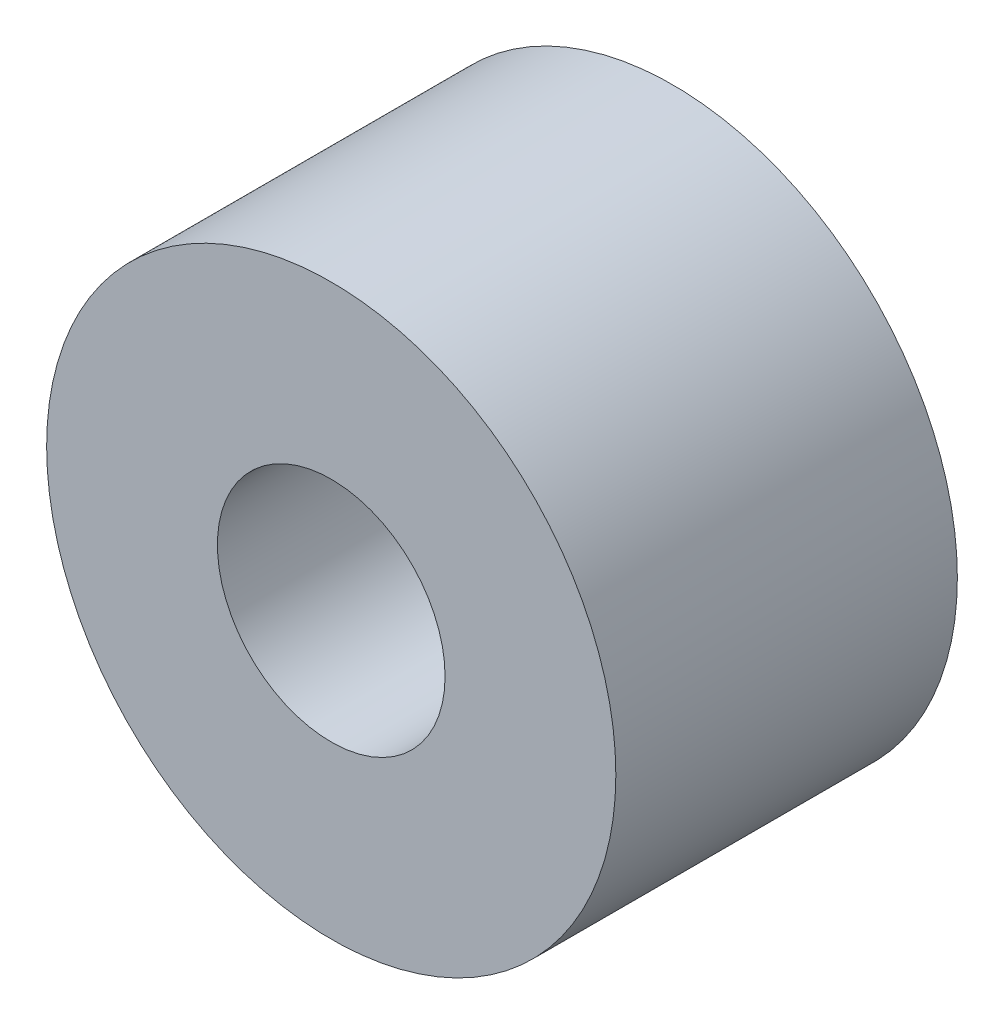
ISO-10303-21;
HEADER;
FILE_DESCRIPTION(('STEP AP214'),'2;1');
FILE_NAME('part.step','',(''),(''),'','','');
FILE_SCHEMA(('AUTOMOTIVE_DESIGN { 1 0 10303 214 1 1 1 1 }'));
ENDSEC;
DATA;
#1=APPLICATION_CONTEXT('core data for automotive mechanical design processes');
#2=APPLICATION_PROTOCOL_DEFINITION('international standard','automotive_design',2000,#1);
#3=PRODUCT_CONTEXT('',#1,'mechanical');
#4=PRODUCT('Part','Part','',(#3));
#5=PRODUCT_RELATED_PRODUCT_CATEGORY('part','',(#4));
#6=PRODUCT_DEFINITION_FORMATION('','',#4);
#7=PRODUCT_DEFINITION_CONTEXT('part definition',#1,'design');
#8=PRODUCT_DEFINITION('design','',#6,#7);
#9=PRODUCT_DEFINITION_SHAPE('','',#8);
#10=(LENGTH_UNIT() NAMED_UNIT(*) SI_UNIT(.MILLI.,.METRE.));
#11=(NAMED_UNIT(*) PLANE_ANGLE_UNIT() SI_UNIT($,.RADIAN.));
#12=(NAMED_UNIT(*) SI_UNIT($,.STERADIAN.) SOLID_ANGLE_UNIT());
#13=UNCERTAINTY_MEASURE_WITH_UNIT(LENGTH_MEASURE(1.E-05),#10,'distance_accuracy_value','');
#14=(GEOMETRIC_REPRESENTATION_CONTEXT(3) GLOBAL_UNCERTAINTY_ASSIGNED_CONTEXT((#13)) GLOBAL_UNIT_ASSIGNED_CONTEXT((#10,
#11,#12)) REPRESENTATION_CONTEXT('',''));
#15=CARTESIAN_POINT('',(0.,0.,0.));
#16=DIRECTION('',(0.,0.,1.));
#17=DIRECTION('',(1.,0.,0.));
#18=AXIS2_PLACEMENT_3D('',#15,#16,#17);
#19=CARTESIAN_POINT('',(0.,0.,45.));
#20=DIRECTION('',(0.,0.,1.));
#21=DIRECTION('',(1.,0.,0.));
#22=AXIS2_PLACEMENT_3D('',#19,#20,#21);
#23=PLANE('',#22);
#24=CARTESIAN_POINT('',(0.,0.,45.));
#25=DIRECTION('',(0.,0.,1.));
#26=DIRECTION('',(1.,0.,0.));
#27=AXIS2_PLACEMENT_3D('',#24,#25,#26);
#28=CIRCLE('',#27,37.5);
#29=CARTESIAN_POINT('',(37.5,0.,45.));
#30=VERTEX_POINT('',#29);
#31=EDGE_CURVE('E10',#30,#30,#28,.T.);
#32=ORIENTED_EDGE('',*,*,#31,.T.);
#33=EDGE_LOOP('',(#32));
#34=FACE_BOUND('',#33,.T.);
#35=CARTESIAN_POINT('',(0.,0.,45.));
#36=DIRECTION('',(0.,0.,1.));
#37=DIRECTION('',(1.,0.,0.));
#38=AXIS2_PLACEMENT_3D('',#35,#36,#37);
#39=CIRCLE('',#38,15.);
#40=CARTESIAN_POINT('',(15.,0.,45.));
#41=VERTEX_POINT('',#40);
#42=EDGE_CURVE('E25',#41,#41,#39,.T.);
#43=ORIENTED_EDGE('',*,*,#42,.F.);
#44=EDGE_LOOP('',(#43));
#45=FACE_BOUND('',#44,.T.);
#46=ADVANCED_FACE('F14',(#34,#45),#23,.T.);
#47=CARTESIAN_POINT('',(0.,0.,0.));
#48=DIRECTION('',(0.,0.,1.));
#49=DIRECTION('',(1.,0.,0.));
#50=AXIS2_PLACEMENT_3D('',#47,#48,#49);
#51=PLANE('',#50);
#52=CARTESIAN_POINT('',(0.,0.,0.));
#53=DIRECTION('',(0.,0.,1.));
#54=DIRECTION('',(1.,0.,0.));
#55=AXIS2_PLACEMENT_3D('',#52,#53,#54);
#56=CIRCLE('',#55,37.5);
#57=CARTESIAN_POINT('',(37.5,0.,0.));
#58=VERTEX_POINT('',#57);
#59=EDGE_CURVE('E18',#58,#58,#56,.T.);
#60=ORIENTED_EDGE('',*,*,#59,.F.);
#61=EDGE_LOOP('',(#60));
#62=FACE_BOUND('',#61,.T.);
#63=CARTESIAN_POINT('',(0.,0.,0.));
#64=DIRECTION('',(0.,0.,1.));
#65=DIRECTION('',(1.,0.,0.));
#66=AXIS2_PLACEMENT_3D('',#63,#64,#65);
#67=CIRCLE('',#66,15.);
#68=CARTESIAN_POINT('',(15.,0.,0.));
#69=VERTEX_POINT('',#68);
#70=EDGE_CURVE('E30',#69,#69,#67,.T.);
#71=ORIENTED_EDGE('',*,*,#70,.T.);
#72=EDGE_LOOP('',(#71));
#73=FACE_BOUND('',#72,.T.);
#74=ADVANCED_FACE('F40',(#62,#73),#51,.F.);
#75=CARTESIAN_POINT('',(0.,0.,45.));
#76=DIRECTION('',(0.,0.,-1.));
#77=DIRECTION('',(-1.,0.,0.));
#78=AXIS2_PLACEMENT_3D('',#75,#76,#77);
#79=CYLINDRICAL_SURFACE('',#78,37.5);
#80=ORIENTED_EDGE('',*,*,#31,.F.);
#81=EDGE_LOOP('',(#80));
#82=FACE_BOUND('',#81,.T.);
#83=ORIENTED_EDGE('',*,*,#59,.T.);
#84=EDGE_LOOP('',(#83));
#85=FACE_BOUND('',#84,.T.);
#86=ADVANCED_FACE('F16',(#82,#85),#79,.T.);
#87=CARTESIAN_POINT('',(0.,0.,45.));
#88=DIRECTION('',(0.,0.,-1.));
#89=DIRECTION('',(-1.,0.,0.));
#90=AXIS2_PLACEMENT_3D('',#87,#88,#89);
#91=CYLINDRICAL_SURFACE('',#90,15.);
#92=ORIENTED_EDGE('',*,*,#42,.T.);
#93=EDGE_LOOP('',(#92));
#94=FACE_BOUND('',#93,.T.);
#95=ORIENTED_EDGE('',*,*,#70,.F.);
#96=EDGE_LOOP('',(#95));
#97=FACE_BOUND('',#96,.T.);
#98=ADVANCED_FACE('F31',(#94,#97),#91,.F.);
#99=CLOSED_SHELL('',(#46,#74,#86,#98));
#100=MANIFOLD_SOLID_BREP('B1',#99);
#101=ADVANCED_BREP_SHAPE_REPRESENTATION('',(#18,#100),#14);
#102=SHAPE_DEFINITION_REPRESENTATION(#9,#101);
ENDSEC;
END-ISO-10303-21;
